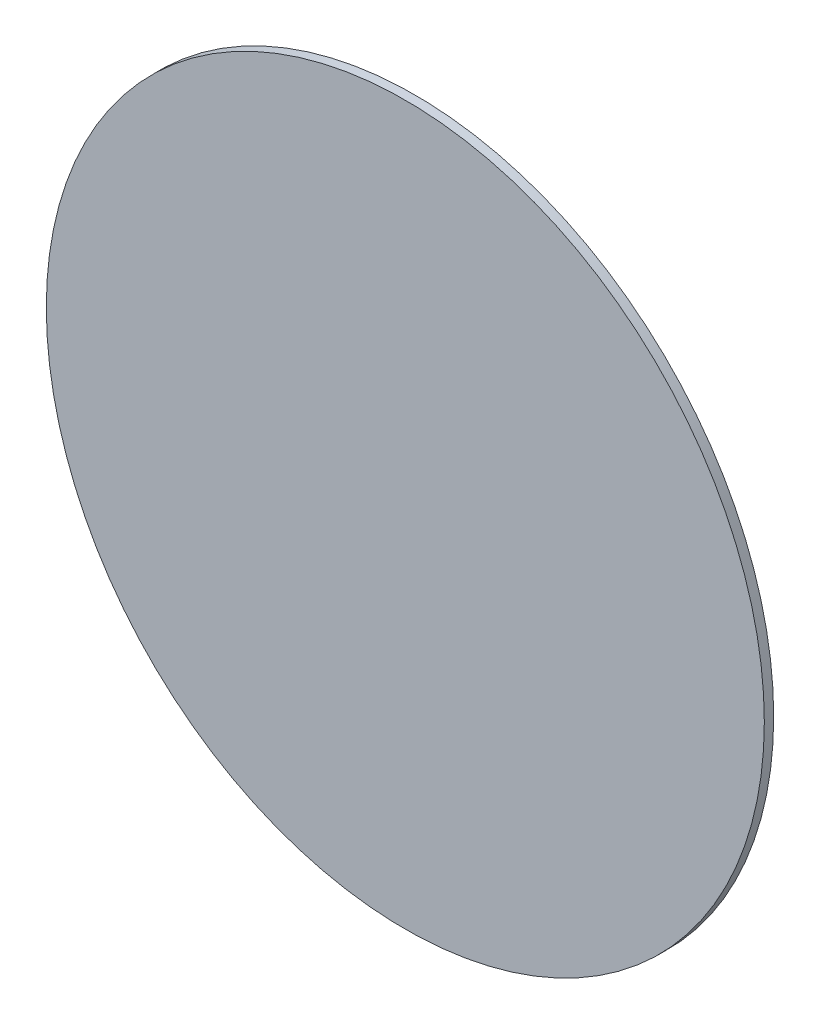
ISO-10303-21;
HEADER;
FILE_DESCRIPTION(('STEP AP214'),'2;1');
FILE_NAME('part.step','',(''),(''),'','','');
FILE_SCHEMA(('AUTOMOTIVE_DESIGN { 1 0 10303 214 1 1 1 1 }'));
ENDSEC;
DATA;
#1=APPLICATION_CONTEXT('core data for automotive mechanical design processes');
#2=APPLICATION_PROTOCOL_DEFINITION('international standard','automotive_design',2000,#1);
#3=PRODUCT_CONTEXT('',#1,'mechanical');
#4=PRODUCT('Part','Part','',(#3));
#5=PRODUCT_RELATED_PRODUCT_CATEGORY('part','',(#4));
#6=PRODUCT_DEFINITION_FORMATION('','',#4);
#7=PRODUCT_DEFINITION_CONTEXT('part definition',#1,'design');
#8=PRODUCT_DEFINITION('design','',#6,#7);
#9=PRODUCT_DEFINITION_SHAPE('','',#8);
#10=(LENGTH_UNIT() NAMED_UNIT(*) SI_UNIT(.MILLI.,.METRE.));
#11=(NAMED_UNIT(*) PLANE_ANGLE_UNIT() SI_UNIT($,.RADIAN.));
#12=(NAMED_UNIT(*) SI_UNIT($,.STERADIAN.) SOLID_ANGLE_UNIT());
#13=UNCERTAINTY_MEASURE_WITH_UNIT(LENGTH_MEASURE(1.E-05),#10,'distance_accuracy_value','');
#14=(GEOMETRIC_REPRESENTATION_CONTEXT(3) GLOBAL_UNCERTAINTY_ASSIGNED_CONTEXT((#13)) GLOBAL_UNIT_ASSIGNED_CONTEXT((#10,
#11,#12)) REPRESENTATION_CONTEXT('',''));
#15=CARTESIAN_POINT('',(0.,0.,0.));
#16=DIRECTION('',(0.,0.,1.));
#17=DIRECTION('',(1.,0.,0.));
#18=AXIS2_PLACEMENT_3D('',#15,#16,#17);
#19=CARTESIAN_POINT('',(0.,0.,10.));
#20=DIRECTION('',(0.,0.,-1.));
#21=DIRECTION('',(-1.,0.,0.));
#22=AXIS2_PLACEMENT_3D('',#19,#20,#21);
#23=CYLINDRICAL_SURFACE('',#22,383.2);
#24=CARTESIAN_POINT('',(0.,0.,10.));
#25=DIRECTION('',(0.,0.,1.));
#26=DIRECTION('',(1.,0.,0.));
#27=AXIS2_PLACEMENT_3D('',#24,#25,#26);
#28=CIRCLE('',#27,383.2);
#29=CARTESIAN_POINT('',(383.2,0.,10.));
#30=VERTEX_POINT('',#29);
#31=EDGE_CURVE('E10',#30,#30,#28,.T.);
#32=ORIENTED_EDGE('',*,*,#31,.F.);
#33=EDGE_LOOP('',(#32));
#34=FACE_BOUND('',#33,.T.);
#35=CARTESIAN_POINT('',(0.,0.,0.));
#36=DIRECTION('',(0.,0.,1.));
#37=DIRECTION('',(1.,0.,0.));
#38=AXIS2_PLACEMENT_3D('',#35,#36,#37);
#39=CIRCLE('',#38,383.2);
#40=CARTESIAN_POINT('',(383.2,0.,0.));
#41=VERTEX_POINT('',#40);
#42=EDGE_CURVE('E37',#41,#41,#39,.T.);
#43=ORIENTED_EDGE('',*,*,#42,.T.);
#44=EDGE_LOOP('',(#43));
#45=FACE_BOUND('',#44,.T.);
#46=ADVANCED_FACE('F34',(#34,#45),#23,.T.);
#47=CARTESIAN_POINT('',(0.,0.,10.));
#48=DIRECTION('',(0.,0.,1.));
#49=DIRECTION('',(1.,0.,0.));
#50=AXIS2_PLACEMENT_3D('',#47,#48,#49);
#51=PLANE('',#50);
#52=ORIENTED_EDGE('',*,*,#31,.T.);
#53=EDGE_LOOP('',(#52));
#54=FACE_BOUND('',#53,.T.);
#55=ADVANCED_FACE('F49',(#54),#51,.T.);
#56=CARTESIAN_POINT('',(0.,0.,0.));
#57=DIRECTION('',(0.,0.,1.));
#58=DIRECTION('',(1.,0.,0.));
#59=AXIS2_PLACEMENT_3D('',#56,#57,#58);
#60=PLANE('',#59);
#61=ORIENTED_EDGE('',*,*,#42,.F.);
#62=EDGE_LOOP('',(#61));
#63=FACE_BOUND('',#62,.T.);
#64=ADVANCED_FACE('F47',(#63),#60,.F.);
#65=CLOSED_SHELL('',(#46,#55,#64));
#66=MANIFOLD_SOLID_BREP('B2',#65);
#67=ADVANCED_BREP_SHAPE_REPRESENTATION('',(#18,#66),#14);
#68=SHAPE_DEFINITION_REPRESENTATION(#9,#67);
ENDSEC;
END-ISO-10303-21;
